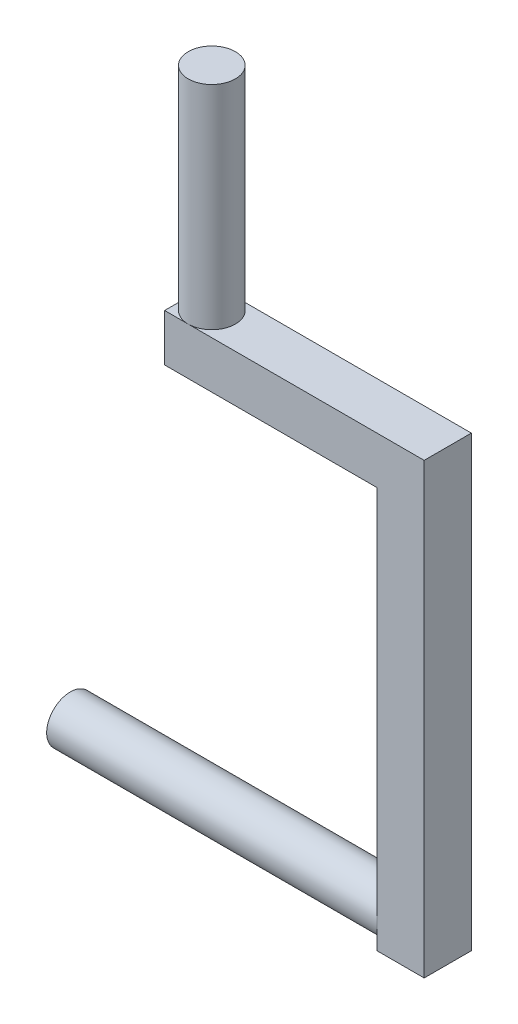
ISO-10303-21;
HEADER;
FILE_DESCRIPTION(('STEP AP214'),'2;1');
FILE_NAME('part.step','',(''),(''),'','','');
FILE_SCHEMA(('AUTOMOTIVE_DESIGN { 1 0 10303 214 1 1 1 1 }'));
ENDSEC;
DATA;
#1=APPLICATION_CONTEXT('core data for automotive mechanical design processes');
#2=APPLICATION_PROTOCOL_DEFINITION('international standard','automotive_design',2000,#1);
#3=PRODUCT_CONTEXT('',#1,'mechanical');
#4=PRODUCT('Part','Part','',(#3));
#5=PRODUCT_RELATED_PRODUCT_CATEGORY('part','',(#4));
#6=PRODUCT_DEFINITION_FORMATION('','',#4);
#7=PRODUCT_DEFINITION_CONTEXT('part definition',#1,'design');
#8=PRODUCT_DEFINITION('design','',#6,#7);
#9=PRODUCT_DEFINITION_SHAPE('','',#8);
#10=(LENGTH_UNIT() NAMED_UNIT(*) SI_UNIT(.MILLI.,.METRE.));
#11=(NAMED_UNIT(*) PLANE_ANGLE_UNIT() SI_UNIT($,.RADIAN.));
#12=(NAMED_UNIT(*) SI_UNIT($,.STERADIAN.) SOLID_ANGLE_UNIT());
#13=UNCERTAINTY_MEASURE_WITH_UNIT(LENGTH_MEASURE(1.E-05),#10,'distance_accuracy_value','');
#14=(GEOMETRIC_REPRESENTATION_CONTEXT(3) GLOBAL_UNCERTAINTY_ASSIGNED_CONTEXT((#13)) GLOBAL_UNIT_ASSIGNED_CONTEXT((#10,
#11,#12)) REPRESENTATION_CONTEXT('',''));
#15=CARTESIAN_POINT('',(0.,0.,0.));
#16=DIRECTION('',(0.,0.,1.));
#17=DIRECTION('',(1.,0.,0.));
#18=AXIS2_PLACEMENT_3D('',#15,#16,#17);
#19=CARTESIAN_POINT('',(50.8,-177.8,-6.35));
#20=DIRECTION('',(1.,0.,0.));
#21=DIRECTION('',(0.,0.,-1.));
#22=AXIS2_PLACEMENT_3D('',#19,#20,#21);
#23=PLANE('',#22);
#24=CARTESIAN_POINT('',(50.8,-171.45,0.));
#25=DIRECTION('',(-1.,0.,0.));
#26=DIRECTION('',(0.,0.,1.));
#27=AXIS2_PLACEMENT_3D('',#24,#25,#26);
#28=CIRCLE('',#27,6.35);
#29=CARTESIAN_POINT('',(50.8,-171.45,-6.35));
#30=VERTEX_POINT('',#29);
#31=CARTESIAN_POINT('',(50.8,-177.8,0.));
#32=VERTEX_POINT('',#31);
#33=EDGE_CURVE('E135',#30,#32,#28,.T.);
#34=ORIENTED_EDGE('',*,*,#33,.F.);
#35=DIRECTION('',(0.,1.,0.));
#36=VECTOR('',#35,1.);
#37=CARTESIAN_POINT('',(50.8,-177.8,-6.35));
#38=LINE('',#37,#36);
#39=CARTESIAN_POINT('',(50.8,-177.8,-6.35));
#40=VERTEX_POINT('',#39);
#41=EDGE_CURVE('E116',#40,#30,#38,.T.);
#42=ORIENTED_EDGE('',*,*,#41,.F.);
#43=DIRECTION('',(0.,0.,-1.));
#44=VECTOR('',#43,1.);
#45=CARTESIAN_POINT('',(50.8,-177.8,-6.35));
#46=LINE('',#45,#44);
#47=EDGE_CURVE('E136',#32,#40,#46,.T.);
#48=ORIENTED_EDGE('',*,*,#47,.F.);
#49=EDGE_LOOP('',(#34,#42,#48));
#50=FACE_BOUND('',#49,.T.);
#51=ADVANCED_FACE('F39',(#50),#23,.F.);
#52=CARTESIAN_POINT('',(50.8,-171.45,6.35));
#53=VERTEX_POINT('',#52);
#54=EDGE_CURVE('E65',#32,#53,#28,.T.);
#55=ORIENTED_EDGE('',*,*,#54,.F.);
#56=CARTESIAN_POINT('',(50.8,-177.8,6.35));
#57=VERTEX_POINT('',#56);
#58=EDGE_CURVE('E149',#57,#32,#46,.T.);
#59=ORIENTED_EDGE('',*,*,#58,.F.);
#60=DIRECTION('',(0.,1.,0.));
#61=VECTOR('',#60,1.);
#62=CARTESIAN_POINT('',(50.8,-177.8,6.35));
#63=LINE('',#62,#61);
#64=EDGE_CURVE('E133',#57,#53,#63,.T.);
#65=ORIENTED_EDGE('',*,*,#64,.T.);
#66=EDGE_LOOP('',(#55,#59,#65));
#67=FACE_BOUND('',#66,.T.);
#68=ADVANCED_FACE('F235',(#67),#23,.F.);
#69=CARTESIAN_POINT('',(0.,-69.85,0.));
#70=DIRECTION('',(0.,1.,0.));
#71=DIRECTION('',(0.,0.,1.));
#72=AXIS2_PLACEMENT_3D('',#69,#70,#71);
#73=PLANE('',#72);
#74=DIRECTION('',(0.,0.,-1.));
#75=VECTOR('',#74,1.);
#76=CARTESIAN_POINT('',(50.8,-69.85,-6.35));
#77=LINE('',#76,#75);
#78=CARTESIAN_POINT('',(50.8,-69.85,6.35));
#79=VERTEX_POINT('',#78);
#80=CARTESIAN_POINT('',(50.8,-69.85,-6.35));
#81=VERTEX_POINT('',#80);
#82=EDGE_CURVE('E131',#79,#81,#77,.T.);
#83=ORIENTED_EDGE('',*,*,#82,.F.);
#84=DIRECTION('',(-1.,0.,0.));
#85=VECTOR('',#84,1.);
#86=CARTESIAN_POINT('',(63.5,-69.85,6.35));
#87=LINE('',#86,#85);
#88=CARTESIAN_POINT('',(-6.35,-69.85,6.35));
#89=VERTEX_POINT('',#88);
#90=EDGE_CURVE('E174',#79,#89,#87,.T.);
#91=ORIENTED_EDGE('',*,*,#90,.T.);
#92=DIRECTION('',(0.,0.,1.));
#93=VECTOR('',#92,1.);
#94=CARTESIAN_POINT('',(-6.35,-69.85,-6.35));
#95=LINE('',#94,#93);
#96=CARTESIAN_POINT('',(-6.35,-69.85,-6.35));
#97=VERTEX_POINT('',#96);
#98=EDGE_CURVE('E169',#97,#89,#95,.T.);
#99=ORIENTED_EDGE('',*,*,#98,.F.);
#100=DIRECTION('',(-1.,0.,0.));
#101=VECTOR('',#100,1.);
#102=CARTESIAN_POINT('',(63.5,-69.85,-6.35));
#103=LINE('',#102,#101);
#104=EDGE_CURVE('E166',#81,#97,#103,.T.);
#105=ORIENTED_EDGE('',*,*,#104,.F.);
#106=EDGE_LOOP('',(#83,#91,#99,#105));
#107=FACE_BOUND('',#106,.T.);
#108=ADVANCED_FACE('F229',(#107),#73,.F.);
#109=CARTESIAN_POINT('',(0.,-57.15,0.));
#110=DIRECTION('',(0.,1.,0.));
#111=DIRECTION('',(0.,0.,1.));
#112=AXIS2_PLACEMENT_3D('',#109,#110,#111);
#113=CYLINDRICAL_SURFACE('',#112,6.35);
#114=CARTESIAN_POINT('',(0.,-57.15,0.));
#115=DIRECTION('',(0.,1.,0.));
#116=DIRECTION('',(0.,0.,1.));
#117=AXIS2_PLACEMENT_3D('',#114,#115,#116);
#118=CIRCLE('',#117,6.35);
#119=CARTESIAN_POINT('',(0.,-57.15,6.35));
#120=VERTEX_POINT('',#119);
#121=CARTESIAN_POINT('',(0.,-57.15,-6.35));
#122=VERTEX_POINT('',#121);
#123=EDGE_CURVE('E11',#120,#122,#118,.T.);
#124=ORIENTED_EDGE('',*,*,#123,.T.);
#125=CARTESIAN_POINT('',(-6.35,-57.15,0.));
#126=VERTEX_POINT('',#125);
#127=EDGE_CURVE('E49',#122,#126,#118,.T.);
#128=ORIENTED_EDGE('',*,*,#127,.T.);
#129=EDGE_CURVE('E50',#126,#120,#118,.T.);
#130=ORIENTED_EDGE('',*,*,#129,.T.);
#131=EDGE_LOOP('',(#124,#128,#130));
#132=FACE_BOUND('',#131,.T.);
#133=CARTESIAN_POINT('',(0.,0.,0.));
#134=DIRECTION('',(0.,1.,0.));
#135=DIRECTION('',(0.,0.,1.));
#136=AXIS2_PLACEMENT_3D('',#133,#134,#135);
#137=CIRCLE('',#136,6.35);
#138=CARTESIAN_POINT('',(0.,0.,6.35));
#139=VERTEX_POINT('',#138);
#140=EDGE_CURVE('E43',#139,#139,#137,.T.);
#141=ORIENTED_EDGE('',*,*,#140,.F.);
#142=EDGE_LOOP('',(#141));
#143=FACE_BOUND('',#142,.T.);
#144=ADVANCED_FACE('F41',(#132,#143),#113,.T.);
#145=CARTESIAN_POINT('',(0.,0.,0.));
#146=DIRECTION('',(0.,1.,0.));
#147=DIRECTION('',(0.,0.,1.));
#148=AXIS2_PLACEMENT_3D('',#145,#146,#147);
#149=PLANE('',#148);
#150=ORIENTED_EDGE('',*,*,#140,.T.);
#151=EDGE_LOOP('',(#150));
#152=FACE_BOUND('',#151,.T.);
#153=ADVANCED_FACE('F227',(#152),#149,.T.);
#154=CARTESIAN_POINT('',(0.,-57.15,0.));
#155=DIRECTION('',(0.,1.,0.));
#156=DIRECTION('',(0.,0.,1.));
#157=AXIS2_PLACEMENT_3D('',#154,#155,#156);
#158=PLANE('',#157);
#159=ORIENTED_EDGE('',*,*,#123,.F.);
#160=DIRECTION('',(-1.,0.,0.));
#161=VECTOR('',#160,1.);
#162=CARTESIAN_POINT('',(63.5,-57.15,6.35));
#163=LINE('',#162,#161);
#164=CARTESIAN_POINT('',(63.5,-57.15,6.35));
#165=VERTEX_POINT('',#164);
#166=EDGE_CURVE('E188',#165,#120,#163,.T.);
#167=ORIENTED_EDGE('',*,*,#166,.F.);
#168=DIRECTION('',(0.,0.,1.));
#169=VECTOR('',#168,1.);
#170=CARTESIAN_POINT('',(63.5,-57.15,-6.35));
#171=LINE('',#170,#169);
#172=CARTESIAN_POINT('',(63.5,-57.15,-6.35));
#173=VERTEX_POINT('',#172);
#174=EDGE_CURVE('E170',#173,#165,#171,.T.);
#175=ORIENTED_EDGE('',*,*,#174,.F.);
#176=DIRECTION('',(-1.,0.,0.));
#177=VECTOR('',#176,1.);
#178=CARTESIAN_POINT('',(63.5,-57.15,-6.35));
#179=LINE('',#178,#177);
#180=EDGE_CURVE('E178',#173,#122,#179,.T.);
#181=ORIENTED_EDGE('',*,*,#180,.T.);
#182=EDGE_LOOP('',(#159,#167,#175,#181));
#183=FACE_BOUND('',#182,.T.);
#184=ADVANCED_FACE('F234',(#183),#158,.T.);
#185=ORIENTED_EDGE('',*,*,#127,.F.);
#186=CARTESIAN_POINT('',(-6.35,-57.15,-6.35));
#187=VERTEX_POINT('',#186);
#188=EDGE_CURVE('E126',#122,#187,#179,.T.);
#189=ORIENTED_EDGE('',*,*,#188,.T.);
#190=DIRECTION('',(0.,0.,1.));
#191=VECTOR('',#190,1.);
#192=CARTESIAN_POINT('',(-6.35,-57.15,-6.35));
#193=LINE('',#192,#191);
#194=EDGE_CURVE('E183',#187,#126,#193,.T.);
#195=ORIENTED_EDGE('',*,*,#194,.T.);
#196=EDGE_LOOP('',(#185,#189,#195));
#197=FACE_BOUND('',#196,.T.);
#198=ADVANCED_FACE('F216',(#197),#158,.T.);
#199=ORIENTED_EDGE('',*,*,#129,.F.);
#200=CARTESIAN_POINT('',(-6.35,-57.15,6.35));
#201=VERTEX_POINT('',#200);
#202=EDGE_CURVE('E182',#126,#201,#193,.T.);
#203=ORIENTED_EDGE('',*,*,#202,.T.);
#204=EDGE_CURVE('E187',#120,#201,#163,.T.);
#205=ORIENTED_EDGE('',*,*,#204,.F.);
#206=EDGE_LOOP('',(#199,#203,#205));
#207=FACE_BOUND('',#206,.T.);
#208=ADVANCED_FACE('F262',(#207),#158,.T.);
#209=CARTESIAN_POINT('',(63.5,-69.85,-6.35));
#210=DIRECTION('',(0.,0.,-1.));
#211=DIRECTION('',(-1.,0.,0.));
#212=AXIS2_PLACEMENT_3D('',#209,#210,#211);
#213=PLANE('',#212);
#214=ORIENTED_EDGE('',*,*,#180,.F.);
#215=DIRECTION('',(0.,1.,0.));
#216=VECTOR('',#215,1.);
#217=CARTESIAN_POINT('',(63.5,-69.85,-6.35));
#218=LINE('',#217,#216);
#219=CARTESIAN_POINT('',(63.5,-177.8,-6.35));
#220=VERTEX_POINT('',#219);
#221=EDGE_CURVE('E193',#220,#173,#218,.T.);
#222=ORIENTED_EDGE('',*,*,#221,.F.);
#223=DIRECTION('',(1.,0.,0.));
#224=VECTOR('',#223,1.);
#225=CARTESIAN_POINT('',(63.5,-177.8,-6.35));
#226=LINE('',#225,#224);
#227=EDGE_CURVE('E122',#40,#220,#226,.T.);
#228=ORIENTED_EDGE('',*,*,#227,.F.);
#229=ORIENTED_EDGE('',*,*,#41,.T.);
#230=EDGE_CURVE('E119',#30,#81,#38,.T.);
#231=ORIENTED_EDGE('',*,*,#230,.T.);
#232=ORIENTED_EDGE('',*,*,#104,.T.);
#233=DIRECTION('',(0.,1.,0.));
#234=VECTOR('',#233,1.);
#235=CARTESIAN_POINT('',(-6.35,-69.85,-6.35));
#236=LINE('',#235,#234);
#237=EDGE_CURVE('E177',#97,#187,#236,.T.);
#238=ORIENTED_EDGE('',*,*,#237,.T.);
#239=ORIENTED_EDGE('',*,*,#188,.F.);
#240=EDGE_LOOP('',(#214,#222,#228,#229,#231,#232,#238,#239));
#241=FACE_BOUND('',#240,.T.);
#242=ADVANCED_FACE('F118',(#241),#213,.T.);
#243=CARTESIAN_POINT('',(63.5,-69.85,-6.35));
#244=DIRECTION('',(-1.,0.,0.));
#245=DIRECTION('',(0.,0.,1.));
#246=AXIS2_PLACEMENT_3D('',#243,#244,#245);
#247=PLANE('',#246);
#248=ORIENTED_EDGE('',*,*,#174,.T.);
#249=DIRECTION('',(0.,1.,0.));
#250=VECTOR('',#249,1.);
#251=CARTESIAN_POINT('',(63.5,-69.85,6.35));
#252=LINE('',#251,#250);
#253=CARTESIAN_POINT('',(63.5,-177.8,6.35));
#254=VERTEX_POINT('',#253);
#255=EDGE_CURVE('E196',#254,#165,#252,.T.);
#256=ORIENTED_EDGE('',*,*,#255,.F.);
#257=DIRECTION('',(0.,0.,1.));
#258=VECTOR('',#257,1.);
#259=CARTESIAN_POINT('',(63.5,-177.8,-6.35));
#260=LINE('',#259,#258);
#261=EDGE_CURVE('E154',#220,#254,#260,.T.);
#262=ORIENTED_EDGE('',*,*,#261,.F.);
#263=ORIENTED_EDGE('',*,*,#221,.T.);
#264=EDGE_LOOP('',(#248,#256,#262,#263));
#265=FACE_BOUND('',#264,.T.);
#266=ADVANCED_FACE('F256',(#265),#247,.F.);
#267=CARTESIAN_POINT('',(63.5,-69.85,6.35));
#268=DIRECTION('',(0.,0.,-1.));
#269=DIRECTION('',(-1.,0.,0.));
#270=AXIS2_PLACEMENT_3D('',#267,#268,#269);
#271=PLANE('',#270);
#272=ORIENTED_EDGE('',*,*,#166,.T.);
#273=ORIENTED_EDGE('',*,*,#204,.T.);
#274=DIRECTION('',(0.,1.,0.));
#275=VECTOR('',#274,1.);
#276=CARTESIAN_POINT('',(-6.35,-69.85,6.35));
#277=LINE('',#276,#275);
#278=EDGE_CURVE('E200',#89,#201,#277,.T.);
#279=ORIENTED_EDGE('',*,*,#278,.F.);
#280=ORIENTED_EDGE('',*,*,#90,.F.);
#281=EDGE_CURVE('E161',#53,#79,#63,.T.);
#282=ORIENTED_EDGE('',*,*,#281,.F.);
#283=ORIENTED_EDGE('',*,*,#64,.F.);
#284=DIRECTION('',(-1.,0.,0.));
#285=VECTOR('',#284,1.);
#286=CARTESIAN_POINT('',(63.5,-177.8,6.35));
#287=LINE('',#286,#285);
#288=EDGE_CURVE('E158',#254,#57,#287,.T.);
#289=ORIENTED_EDGE('',*,*,#288,.F.);
#290=ORIENTED_EDGE('',*,*,#255,.T.);
#291=EDGE_LOOP('',(#272,#273,#279,#280,#282,#283,#289,#290));
#292=FACE_BOUND('',#291,.T.);
#293=ADVANCED_FACE('F251',(#292),#271,.F.);
#294=CARTESIAN_POINT('',(-6.35,-69.85,-6.35));
#295=DIRECTION('',(-1.,0.,0.));
#296=DIRECTION('',(0.,0.,1.));
#297=AXIS2_PLACEMENT_3D('',#294,#295,#296);
#298=PLANE('',#297);
#299=ORIENTED_EDGE('',*,*,#194,.F.);
#300=ORIENTED_EDGE('',*,*,#237,.F.);
#301=ORIENTED_EDGE('',*,*,#98,.T.);
#302=ORIENTED_EDGE('',*,*,#278,.T.);
#303=ORIENTED_EDGE('',*,*,#202,.F.);
#304=EDGE_LOOP('',(#299,#300,#301,#302,#303));
#305=FACE_BOUND('',#304,.T.);
#306=ADVANCED_FACE('F212',(#305),#298,.T.);
#307=EDGE_CURVE('E57',#53,#30,#28,.T.);
#308=ORIENTED_EDGE('',*,*,#307,.F.);
#309=ORIENTED_EDGE('',*,*,#281,.T.);
#310=ORIENTED_EDGE('',*,*,#82,.T.);
#311=ORIENTED_EDGE('',*,*,#230,.F.);
#312=EDGE_LOOP('',(#308,#309,#310,#311));
#313=FACE_BOUND('',#312,.T.);
#314=ADVANCED_FACE('F129',(#313),#23,.F.);
#315=CARTESIAN_POINT('',(0.,-177.8,0.));
#316=DIRECTION('',(0.,-1.,0.));
#317=DIRECTION('',(0.,0.,-1.));
#318=AXIS2_PLACEMENT_3D('',#315,#316,#317);
#319=PLANE('',#318);
#320=ORIENTED_EDGE('',*,*,#58,.T.);
#321=ORIENTED_EDGE('',*,*,#47,.T.);
#322=ORIENTED_EDGE('',*,*,#227,.T.);
#323=ORIENTED_EDGE('',*,*,#261,.T.);
#324=ORIENTED_EDGE('',*,*,#288,.T.);
#325=EDGE_LOOP('',(#320,#321,#322,#323,#324));
#326=FACE_BOUND('',#325,.T.);
#327=ADVANCED_FACE('F245',(#326),#319,.T.);
#328=CARTESIAN_POINT('',(-38.1,-171.45,0.));
#329=DIRECTION('',(1.,0.,0.));
#330=DIRECTION('',(0.,0.,-1.));
#331=AXIS2_PLACEMENT_3D('',#328,#329,#330);
#332=CYLINDRICAL_SURFACE('',#331,6.35);
#333=CARTESIAN_POINT('',(-38.1,-171.45,0.));
#334=DIRECTION('',(-1.,0.,0.));
#335=DIRECTION('',(0.,0.,1.));
#336=AXIS2_PLACEMENT_3D('',#333,#334,#335);
#337=CIRCLE('',#336,6.35);
#338=CARTESIAN_POINT('',(-38.1,-171.45,6.35));
#339=VERTEX_POINT('',#338);
#340=EDGE_CURVE('E143',#339,#339,#337,.T.);
#341=ORIENTED_EDGE('',*,*,#340,.F.);
#342=EDGE_LOOP('',(#341));
#343=FACE_BOUND('',#342,.T.);
#344=ORIENTED_EDGE('',*,*,#307,.T.);
#345=ORIENTED_EDGE('',*,*,#33,.T.);
#346=ORIENTED_EDGE('',*,*,#54,.T.);
#347=EDGE_LOOP('',(#344,#345,#346));
#348=FACE_BOUND('',#347,.T.);
#349=ADVANCED_FACE('F141',(#343,#348),#332,.T.);
#350=CARTESIAN_POINT('',(-38.1,-171.45,0.));
#351=DIRECTION('',(-1.,0.,0.));
#352=DIRECTION('',(0.,0.,1.));
#353=AXIS2_PLACEMENT_3D('',#350,#351,#352);
#354=PLANE('',#353);
#355=ORIENTED_EDGE('',*,*,#340,.T.);
#356=EDGE_LOOP('',(#355));
#357=FACE_BOUND('',#356,.T.);
#358=ADVANCED_FACE('F358',(#357),#354,.T.);
#359=CLOSED_SHELL('',(#51,#68,#108,#144,#153,#184,#198,#208,#242,#266,#293,#306,#314,#327,#349,#358));
#360=MANIFOLD_SOLID_BREP('B2',#359);
#361=ADVANCED_BREP_SHAPE_REPRESENTATION('',(#18,#360),#14);
#362=SHAPE_DEFINITION_REPRESENTATION(#9,#361);
ENDSEC;
END-ISO-10303-21;
